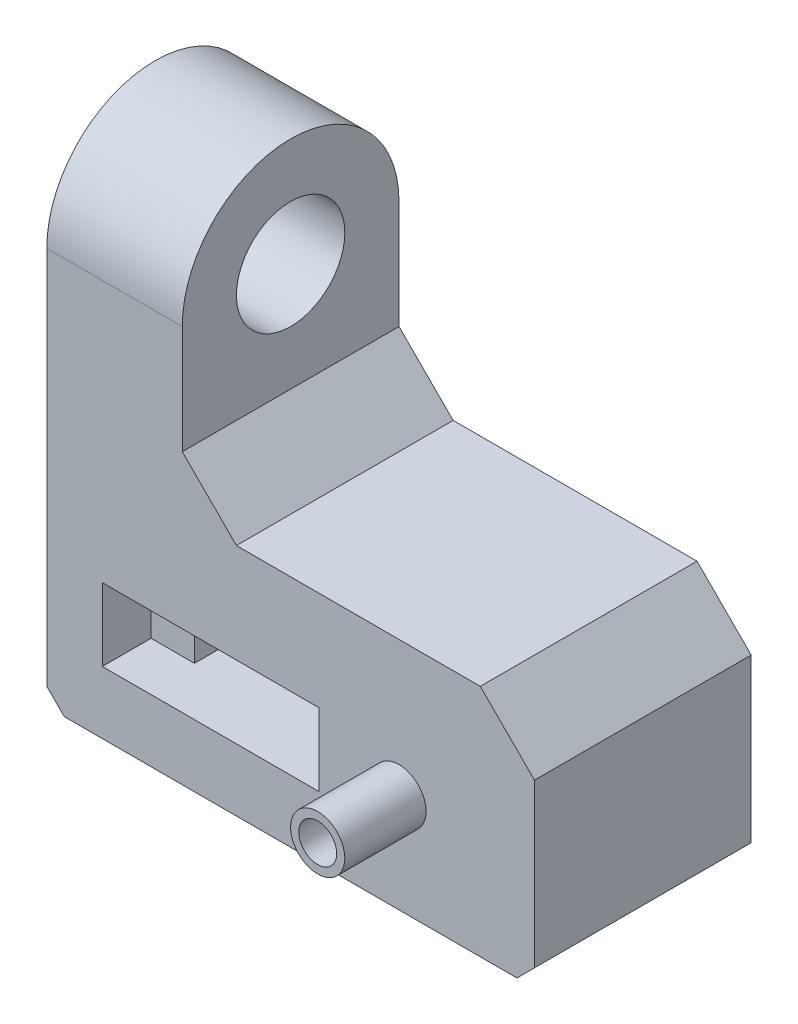
ISO-10303-21;
HEADER;
FILE_DESCRIPTION(('STEP AP214'),'2;1');
FILE_NAME('part.step','',(''),(''),'','','');
FILE_SCHEMA(('AUTOMOTIVE_DESIGN { 1 0 10303 214 1 1 1 1 }'));
ENDSEC;
DATA;
#1=APPLICATION_CONTEXT('core data for automotive mechanical design processes');
#2=APPLICATION_PROTOCOL_DEFINITION('international standard','automotive_design',2000,#1);
#3=PRODUCT_CONTEXT('',#1,'mechanical');
#4=PRODUCT('Part','Part','',(#3));
#5=PRODUCT_RELATED_PRODUCT_CATEGORY('part','',(#4));
#6=PRODUCT_DEFINITION_FORMATION('','',#4);
#7=PRODUCT_DEFINITION_CONTEXT('part definition',#1,'design');
#8=PRODUCT_DEFINITION('design','',#6,#7);
#9=PRODUCT_DEFINITION_SHAPE('','',#8);
#10=(LENGTH_UNIT() NAMED_UNIT(*) SI_UNIT(.MILLI.,.METRE.));
#11=(NAMED_UNIT(*) PLANE_ANGLE_UNIT() SI_UNIT($,.RADIAN.));
#12=(NAMED_UNIT(*) SI_UNIT($,.STERADIAN.) SOLID_ANGLE_UNIT());
#13=UNCERTAINTY_MEASURE_WITH_UNIT(LENGTH_MEASURE(1.E-05),#10,'distance_accuracy_value','');
#14=(GEOMETRIC_REPRESENTATION_CONTEXT(3) GLOBAL_UNCERTAINTY_ASSIGNED_CONTEXT((#13)) GLOBAL_UNIT_ASSIGNED_CONTEXT((#10,
#11,#12)) REPRESENTATION_CONTEXT('',''));
#15=CARTESIAN_POINT('',(0.,0.,0.));
#16=DIRECTION('',(0.,0.,1.));
#17=DIRECTION('',(1.,0.,0.));
#18=AXIS2_PLACEMENT_3D('',#15,#16,#17);
#19=CARTESIAN_POINT('',(-46.25,25.,-3.11126983722082));
#20=DIRECTION('',(0.,0.,1.));
#21=DIRECTION('',(1.,0.,0.));
#22=AXIS2_PLACEMENT_3D('',#19,#20,#21);
#23=CYLINDRICAL_SURFACE('',#22,1.1);
#24=CARTESIAN_POINT('',(-46.25,25.,31.));
#25=DIRECTION('',(0.,0.,1.));
#26=DIRECTION('',(1.,0.,0.));
#27=AXIS2_PLACEMENT_3D('',#24,#25,#26);
#28=CIRCLE('',#27,1.1);
#29=CARTESIAN_POINT('',(-45.15,25.,31.));
#30=VERTEX_POINT('',#29);
#31=EDGE_CURVE('E456',#30,#30,#28,.T.);
#32=ORIENTED_EDGE('',*,*,#31,.T.);
#33=EDGE_LOOP('',(#32));
#34=FACE_BOUND('',#33,.T.);
#35=CARTESIAN_POINT('',(-46.25,25.,7.18643250277138));
#36=DIRECTION('',(0.,0.,-1.));
#37=DIRECTION('',(-1.,0.,0.));
#38=AXIS2_PLACEMENT_3D('',#35,#36,#37);
#39=CIRCLE('',#38,1.1);
#40=CARTESIAN_POINT('',(-47.35,25.,7.18643250277138));
#41=VERTEX_POINT('',#40);
#42=EDGE_CURVE('E12',#41,#41,#39,.F.);
#43=ORIENTED_EDGE('',*,*,#42,.F.);
#44=EDGE_LOOP('',(#43));
#45=FACE_BOUND('',#44,.T.);
#46=ADVANCED_FACE('F73',(#34,#45),#23,.F.);
#47=CARTESIAN_POINT('',(-79.75,31.7,31.));
#48=DIRECTION('',(0.,1.,0.));
#49=DIRECTION('',(0.,0.,1.));
#50=AXIS2_PLACEMENT_3D('',#47,#48,#49);
#51=PLANE('',#50);
#52=DIRECTION('',(0.,0.,1.));
#53=VECTOR('',#52,1.);
#54=CARTESIAN_POINT('',(-71.75,31.7,-27.4874516825405));
#55=LINE('',#54,#53);
#56=CARTESIAN_POINT('',(-71.75,31.7,22.1864325027714));
#57=VERTEX_POINT('',#56);
#58=CARTESIAN_POINT('',(-71.75,31.7,31.));
#59=VERTEX_POINT('',#58);
#60=EDGE_CURVE('E433',#57,#59,#55,.T.);
#61=ORIENTED_EDGE('',*,*,#60,.F.);
#62=DIRECTION('',(1.,0.,0.));
#63=VECTOR('',#62,1.);
#64=CARTESIAN_POINT('',(-79.75,31.7,22.1864325027714));
#65=LINE('',#64,#63);
#66=CARTESIAN_POINT('',(-47.75,31.7,22.1864325027714));
#67=VERTEX_POINT('',#66);
#68=EDGE_CURVE('E494',#57,#67,#65,.T.);
#69=ORIENTED_EDGE('',*,*,#68,.T.);
#70=DIRECTION('',(0.,0.,1.));
#71=VECTOR('',#70,1.);
#72=CARTESIAN_POINT('',(-47.75,31.7,-27.4874516825405));
#73=LINE('',#72,#71);
#74=CARTESIAN_POINT('',(-47.75,31.7,31.));
#75=VERTEX_POINT('',#74);
#76=EDGE_CURVE('E428',#67,#75,#73,.T.);
#77=ORIENTED_EDGE('',*,*,#76,.T.);
#78=DIRECTION('',(-1.,0.,0.));
#79=VECTOR('',#78,1.);
#80=CARTESIAN_POINT('',(-79.75,31.7,31.));
#81=LINE('',#80,#79);
#82=CARTESIAN_POINT('',(-39.75,31.7,31.));
#83=VERTEX_POINT('',#82);
#84=EDGE_CURVE('E374',#83,#75,#81,.T.);
#85=ORIENTED_EDGE('',*,*,#84,.F.);
#86=DIRECTION('',(0.,0.,1.));
#87=VECTOR('',#86,1.);
#88=CARTESIAN_POINT('',(-39.75,31.7,31.));
#89=LINE('',#88,#87);
#90=CARTESIAN_POINT('',(-39.75,31.7,40.));
#91=VERTEX_POINT('',#90);
#92=EDGE_CURVE('E377',#83,#91,#89,.T.);
#93=ORIENTED_EDGE('',*,*,#92,.T.);
#94=DIRECTION('',(-1.,0.,0.));
#95=VECTOR('',#94,1.);
#96=CARTESIAN_POINT('',(-79.75,31.7,40.));
#97=LINE('',#96,#95);
#98=CARTESIAN_POINT('',(-79.75,31.7,40.));
#99=VERTEX_POINT('',#98);
#100=EDGE_CURVE('E382',#91,#99,#97,.T.);
#101=ORIENTED_EDGE('',*,*,#100,.T.);
#102=DIRECTION('',(0.,0.,1.));
#103=VECTOR('',#102,1.);
#104=CARTESIAN_POINT('',(-79.75,31.7,31.));
#105=LINE('',#104,#103);
#106=CARTESIAN_POINT('',(-79.75,31.7,31.));
#107=VERTEX_POINT('',#106);
#108=EDGE_CURVE('E357',#107,#99,#105,.T.);
#109=ORIENTED_EDGE('',*,*,#108,.F.);
#110=EDGE_CURVE('E402',#59,#107,#81,.T.);
#111=ORIENTED_EDGE('',*,*,#110,.F.);
#112=EDGE_LOOP('',(#61,#69,#77,#85,#93,#101,#109,#111));
#113=FACE_BOUND('',#112,.T.);
#114=ADVANCED_FACE('F608',(#113),#51,.F.);
#115=CARTESIAN_POINT('',(-79.75,18.3,31.));
#116=DIRECTION('',(0.,-1.,0.));
#117=DIRECTION('',(1.,0.,0.));
#118=AXIS2_PLACEMENT_3D('',#115,#116,#117);
#119=PLANE('',#118);
#120=DIRECTION('',(0.,0.,1.));
#121=VECTOR('',#120,1.);
#122=CARTESIAN_POINT('',(-47.75,18.3,-27.4874516825405));
#123=LINE('',#122,#121);
#124=CARTESIAN_POINT('',(-47.75,18.3,22.1864325027714));
#125=VERTEX_POINT('',#124);
#126=CARTESIAN_POINT('',(-47.75,18.3,31.));
#127=VERTEX_POINT('',#126);
#128=EDGE_CURVE('E422',#125,#127,#123,.T.);
#129=ORIENTED_EDGE('',*,*,#128,.F.);
#130=DIRECTION('',(-1.,0.,0.));
#131=VECTOR('',#130,1.);
#132=CARTESIAN_POINT('',(-79.75,18.3,22.1864325027714));
#133=LINE('',#132,#131);
#134=CARTESIAN_POINT('',(-71.75,18.3,22.1864325027714));
#135=VERTEX_POINT('',#134);
#136=EDGE_CURVE('E498',#125,#135,#133,.T.);
#137=ORIENTED_EDGE('',*,*,#136,.T.);
#138=DIRECTION('',(0.,0.,1.));
#139=VECTOR('',#138,1.);
#140=CARTESIAN_POINT('',(-71.75,18.3,-27.4874516825405));
#141=LINE('',#140,#139);
#142=CARTESIAN_POINT('',(-71.75,18.3,31.));
#143=VERTEX_POINT('',#142);
#144=EDGE_CURVE('E423',#135,#143,#141,.T.);
#145=ORIENTED_EDGE('',*,*,#144,.T.);
#146=DIRECTION('',(1.,0.,0.));
#147=VECTOR('',#146,1.);
#148=CARTESIAN_POINT('',(-79.75,18.3,31.));
#149=LINE('',#148,#147);
#150=CARTESIAN_POINT('',(-79.75,18.3,31.));
#151=VERTEX_POINT('',#150);
#152=EDGE_CURVE('E407',#151,#143,#149,.T.);
#153=ORIENTED_EDGE('',*,*,#152,.F.);
#154=DIRECTION('',(0.,0.,1.));
#155=VECTOR('',#154,1.);
#156=CARTESIAN_POINT('',(-79.75,18.3,31.));
#157=LINE('',#156,#155);
#158=CARTESIAN_POINT('',(-79.75,18.3,40.));
#159=VERTEX_POINT('',#158);
#160=EDGE_CURVE('E369',#151,#159,#157,.T.);
#161=ORIENTED_EDGE('',*,*,#160,.T.);
#162=DIRECTION('',(1.,0.,0.));
#163=VECTOR('',#162,1.);
#164=CARTESIAN_POINT('',(-79.75,18.3,40.));
#165=LINE('',#164,#163);
#166=CARTESIAN_POINT('',(-39.75,18.3,40.));
#167=VERTEX_POINT('',#166);
#168=EDGE_CURVE('E391',#159,#167,#165,.T.);
#169=ORIENTED_EDGE('',*,*,#168,.T.);
#170=DIRECTION('',(0.,0.,1.));
#171=VECTOR('',#170,1.);
#172=CARTESIAN_POINT('',(-39.75,18.3,31.));
#173=LINE('',#172,#171);
#174=CARTESIAN_POINT('',(-39.75,18.3,31.));
#175=VERTEX_POINT('',#174);
#176=EDGE_CURVE('E373',#175,#167,#173,.T.);
#177=ORIENTED_EDGE('',*,*,#176,.F.);
#178=EDGE_CURVE('E411',#127,#175,#149,.T.);
#179=ORIENTED_EDGE('',*,*,#178,.F.);
#180=EDGE_LOOP('',(#129,#137,#145,#153,#161,#169,#177,#179));
#181=FACE_BOUND('',#180,.T.);
#182=ADVANCED_FACE('F615',(#181),#119,.F.);
#183=CARTESIAN_POINT('',(-71.75,18.3,-27.4874516825405));
#184=DIRECTION('',(-1.,0.,0.));
#185=DIRECTION('',(0.,0.,1.));
#186=AXIS2_PLACEMENT_3D('',#183,#184,#185);
#187=PLANE('',#186);
#188=ORIENTED_EDGE('',*,*,#144,.F.);
#189=DIRECTION('',(0.,1.,0.));
#190=VECTOR('',#189,1.);
#191=CARTESIAN_POINT('',(-71.75,18.3,22.1864325027714));
#192=LINE('',#191,#190);
#193=EDGE_CURVE('E304',#135,#57,#192,.T.);
#194=ORIENTED_EDGE('',*,*,#193,.T.);
#195=ORIENTED_EDGE('',*,*,#60,.T.);
#196=DIRECTION('',(0.,-1.,0.));
#197=VECTOR('',#196,1.);
#198=CARTESIAN_POINT('',(-71.75,18.3,31.));
#199=LINE('',#198,#197);
#200=EDGE_CURVE('E443',#59,#143,#199,.T.);
#201=ORIENTED_EDGE('',*,*,#200,.T.);
#202=EDGE_LOOP('',(#188,#194,#195,#201));
#203=FACE_BOUND('',#202,.T.);
#204=ADVANCED_FACE('F634',(#203),#187,.F.);
#205=CARTESIAN_POINT('',(-73.25,25.,-3.11126983722082));
#206=DIRECTION('',(0.,0.,1.));
#207=DIRECTION('',(1.,0.,0.));
#208=AXIS2_PLACEMENT_3D('',#205,#206,#207);
#209=CYLINDRICAL_SURFACE('',#208,1.10000000000001);
#210=CARTESIAN_POINT('',(-73.25,25.,22.1864325027714));
#211=DIRECTION('',(0.,0.,1.));
#212=DIRECTION('',(1.,0.,0.));
#213=AXIS2_PLACEMENT_3D('',#210,#211,#212);
#214=CIRCLE('',#213,1.10000000000001);
#215=CARTESIAN_POINT('',(-72.15,25.,22.1864325027714));
#216=VERTEX_POINT('',#215);
#217=EDGE_CURVE('E301',#216,#216,#214,.F.);
#218=ORIENTED_EDGE('',*,*,#217,.T.);
#219=EDGE_LOOP('',(#218));
#220=FACE_BOUND('',#219,.T.);
#221=CARTESIAN_POINT('',(-73.25,25.,31.));
#222=DIRECTION('',(0.,0.,1.));
#223=DIRECTION('',(1.,0.,0.));
#224=AXIS2_PLACEMENT_3D('',#221,#222,#223);
#225=CIRCLE('',#224,1.10000000000001);
#226=CARTESIAN_POINT('',(-72.15,25.,31.));
#227=VERTEX_POINT('',#226);
#228=EDGE_CURVE('E447',#227,#227,#225,.T.);
#229=ORIENTED_EDGE('',*,*,#228,.T.);
#230=EDGE_LOOP('',(#229));
#231=FACE_BOUND('',#230,.T.);
#232=ADVANCED_FACE('F622',(#220,#231),#209,.F.);
#233=CARTESIAN_POINT('',(-90.,50.,40.));
#234=DIRECTION('',(1.,0.,0.));
#235=DIRECTION('',(0.,0.,-1.));
#236=AXIS2_PLACEMENT_3D('',#233,#234,#235);
#237=PLANE('',#236);
#238=DIRECTION('',(0.,1.,0.));
#239=VECTOR('',#238,1.);
#240=CARTESIAN_POINT('',(-90.,35.,22.1864325027714));
#241=LINE('',#240,#239);
#242=CARTESIAN_POINT('',(-90.,15.,22.1864325027714));
#243=VERTEX_POINT('',#242);
#244=CARTESIAN_POINT('',(-90.,35.,22.1864325027714));
#245=VERTEX_POINT('',#244);
#246=EDGE_CURVE('E553',#243,#245,#241,.T.);
#247=ORIENTED_EDGE('',*,*,#246,.F.);
#248=DIRECTION('',(0.,0.,1.));
#249=VECTOR('',#248,1.);
#250=CARTESIAN_POINT('',(-90.,15.,7.18643250277138));
#251=LINE('',#250,#249);
#252=CARTESIAN_POINT('',(-90.,15.,7.18643250277138));
#253=VERTEX_POINT('',#252);
#254=EDGE_CURVE('E549',#253,#243,#251,.T.);
#255=ORIENTED_EDGE('',*,*,#254,.F.);
#256=DIRECTION('',(0.,-1.,0.));
#257=VECTOR('',#256,1.);
#258=CARTESIAN_POINT('',(-90.,35.,7.18643250277138));
#259=LINE('',#258,#257);
#260=CARTESIAN_POINT('',(-90.,35.,7.18643250277138));
#261=VERTEX_POINT('',#260);
#262=EDGE_CURVE('E255',#261,#253,#259,.T.);
#263=ORIENTED_EDGE('',*,*,#262,.F.);
#264=DIRECTION('',(0.,0.,-1.));
#265=VECTOR('',#264,1.);
#266=CARTESIAN_POINT('',(-90.,35.,7.18643250277138));
#267=LINE('',#266,#265);
#268=EDGE_CURVE('E98',#245,#261,#267,.T.);
#269=ORIENTED_EDGE('',*,*,#268,.F.);
#270=EDGE_LOOP('',(#247,#255,#263,#269));
#271=FACE_BOUND('',#270,.T.);
#272=CARTESIAN_POINT('',(-90.,80.,20.));
#273=DIRECTION('',(1.,0.,0.));
#274=DIRECTION('',(0.,0.,-1.));
#275=AXIS2_PLACEMENT_3D('',#272,#273,#274);
#276=CIRCLE('',#275,10.);
#277=CARTESIAN_POINT('',(-90.,80.,10.));
#278=VERTEX_POINT('',#277);
#279=EDGE_CURVE('E490',#278,#278,#276,.F.);
#280=ORIENTED_EDGE('',*,*,#279,.F.);
#281=EDGE_LOOP('',(#280));
#282=FACE_BOUND('',#281,.T.);
#283=DIRECTION('',(0.,-1.,0.));
#284=VECTOR('',#283,1.);
#285=CARTESIAN_POINT('',(-90.,50.,0.));
#286=LINE('',#285,#284);
#287=CARTESIAN_POINT('',(-90.,80.,0.));
#288=VERTEX_POINT('',#287);
#289=CARTESIAN_POINT('',(-90.,10.,0.));
#290=VERTEX_POINT('',#289);
#291=EDGE_CURVE('E351',#288,#290,#286,.T.);
#292=ORIENTED_EDGE('',*,*,#291,.T.);
#293=DIRECTION('',(0.,0.,1.));
#294=VECTOR('',#293,1.);
#295=CARTESIAN_POINT('',(-90.,10.,40.));
#296=LINE('',#295,#294);
#297=CARTESIAN_POINT('',(-90.,10.,40.));
#298=VERTEX_POINT('',#297);
#299=EDGE_CURVE('E275',#290,#298,#296,.T.);
#300=ORIENTED_EDGE('',*,*,#299,.T.);
#301=DIRECTION('',(0.,-1.,0.));
#302=VECTOR('',#301,1.);
#303=CARTESIAN_POINT('',(-90.,50.,40.));
#304=LINE('',#303,#302);
#305=CARTESIAN_POINT('',(-90.,80.,40.));
#306=VERTEX_POINT('',#305);
#307=EDGE_CURVE('E355',#306,#298,#304,.T.);
#308=ORIENTED_EDGE('',*,*,#307,.F.);
#309=CARTESIAN_POINT('',(-90.,80.,20.));
#310=DIRECTION('',(1.,0.,0.));
#311=DIRECTION('',(0.,0.,-1.));
#312=AXIS2_PLACEMENT_3D('',#309,#310,#311);
#313=CIRCLE('',#312,20.);
#314=EDGE_CURVE('E471',#306,#288,#313,.F.);
#315=ORIENTED_EDGE('',*,*,#314,.T.);
#316=EDGE_LOOP('',(#292,#300,#308,#315));
#317=FACE_BOUND('',#316,.T.);
#318=ADVANCED_FACE('F685',(#271,#282,#317),#237,.F.);
#319=CARTESIAN_POINT('',(-65.,100.,0.));
#320=DIRECTION('',(1.,0.,0.));
#321=DIRECTION('',(0.,0.,-1.));
#322=AXIS2_PLACEMENT_3D('',#319,#320,#321);
#323=PLANE('',#322);
#324=CARTESIAN_POINT('',(-65.,80.,20.));
#325=DIRECTION('',(1.,0.,0.));
#326=DIRECTION('',(0.,0.,-1.));
#327=AXIS2_PLACEMENT_3D('',#324,#325,#326);
#328=CIRCLE('',#327,10.);
#329=CARTESIAN_POINT('',(-65.,80.,10.));
#330=VERTEX_POINT('',#329);
#331=EDGE_CURVE('E486',#330,#330,#328,.T.);
#332=ORIENTED_EDGE('',*,*,#331,.F.);
#333=EDGE_LOOP('',(#332));
#334=FACE_BOUND('',#333,.T.);
#335=DIRECTION('',(0.,-1.,0.));
#336=VECTOR('',#335,1.);
#337=CARTESIAN_POINT('',(-65.,100.,40.));
#338=LINE('',#337,#336);
#339=CARTESIAN_POINT('',(-65.,80.,40.));
#340=VERTEX_POINT('',#339);
#341=CARTESIAN_POINT('',(-65.,60.,40.));
#342=VERTEX_POINT('',#341);
#343=EDGE_CURVE('E467',#340,#342,#338,.T.);
#344=ORIENTED_EDGE('',*,*,#343,.T.);
#345=DIRECTION('',(0.,0.,-1.));
#346=VECTOR('',#345,1.);
#347=CARTESIAN_POINT('',(-65.,60.,0.));
#348=LINE('',#347,#346);
#349=CARTESIAN_POINT('',(-65.,60.,0.));
#350=VERTEX_POINT('',#349);
#351=EDGE_CURVE('E292',#342,#350,#348,.T.);
#352=ORIENTED_EDGE('',*,*,#351,.T.);
#353=DIRECTION('',(0.,-1.,0.));
#354=VECTOR('',#353,1.);
#355=CARTESIAN_POINT('',(-65.,100.,0.));
#356=LINE('',#355,#354);
#357=CARTESIAN_POINT('',(-65.,80.,0.));
#358=VERTEX_POINT('',#357);
#359=EDGE_CURVE('E460',#358,#350,#356,.T.);
#360=ORIENTED_EDGE('',*,*,#359,.F.);
#361=CARTESIAN_POINT('',(-65.,80.,20.));
#362=DIRECTION('',(1.,0.,0.));
#363=DIRECTION('',(0.,0.,-1.));
#364=AXIS2_PLACEMENT_3D('',#361,#362,#363);
#365=CIRCLE('',#364,20.);
#366=EDGE_CURVE('E476',#358,#340,#365,.T.);
#367=ORIENTED_EDGE('',*,*,#366,.T.);
#368=EDGE_LOOP('',(#344,#352,#360,#367));
#369=FACE_BOUND('',#368,.T.);
#370=ADVANCED_FACE('F638',(#334,#369),#323,.T.);
#371=CARTESIAN_POINT('',(0.,0.,31.));
#372=DIRECTION('',(0.,0.,-1.));
#373=DIRECTION('',(-1.,0.,0.));
#374=AXIS2_PLACEMENT_3D('',#371,#372,#373);
#375=PLANE('',#374);
#376=ORIENTED_EDGE('',*,*,#228,.F.);
#377=EDGE_LOOP('',(#376));
#378=FACE_BOUND('',#377,.T.);
#379=ORIENTED_EDGE('',*,*,#200,.F.);
#380=ORIENTED_EDGE('',*,*,#110,.T.);
#381=DIRECTION('',(0.,-1.,0.));
#382=VECTOR('',#381,1.);
#383=CARTESIAN_POINT('',(-79.75,18.3,31.));
#384=LINE('',#383,#382);
#385=EDGE_CURVE('E386',#107,#151,#384,.T.);
#386=ORIENTED_EDGE('',*,*,#385,.T.);
#387=ORIENTED_EDGE('',*,*,#152,.T.);
#388=EDGE_LOOP('',(#379,#380,#386,#387));
#389=FACE_BOUND('',#388,.T.);
#390=ADVANCED_FACE('F635',(#378,#389),#375,.F.);
#391=ORIENTED_EDGE('',*,*,#31,.F.);
#392=EDGE_LOOP('',(#391));
#393=FACE_BOUND('',#392,.T.);
#394=DIRECTION('',(0.,1.,0.));
#395=VECTOR('',#394,1.);
#396=CARTESIAN_POINT('',(-47.75,18.3,31.));
#397=LINE('',#396,#395);
#398=EDGE_CURVE('E439',#127,#75,#397,.T.);
#399=ORIENTED_EDGE('',*,*,#398,.F.);
#400=ORIENTED_EDGE('',*,*,#178,.T.);
#401=DIRECTION('',(0.,1.,0.));
#402=VECTOR('',#401,1.);
#403=CARTESIAN_POINT('',(-39.75,18.3,31.));
#404=LINE('',#403,#402);
#405=EDGE_CURVE('E403',#175,#83,#404,.T.);
#406=ORIENTED_EDGE('',*,*,#405,.T.);
#407=ORIENTED_EDGE('',*,*,#84,.T.);
#408=EDGE_LOOP('',(#399,#400,#406,#407));
#409=FACE_BOUND('',#408,.T.);
#410=ADVANCED_FACE('F637',(#393,#409),#375,.F.);
#411=CARTESIAN_POINT('',(0.,50.,40.));
#412=DIRECTION('',(-1.,0.,0.));
#413=DIRECTION('',(0.,-1.,0.));
#414=AXIS2_PLACEMENT_3D('',#411,#412,#413);
#415=PLANE('',#414);
#416=DIRECTION('',(0.,1.,0.));
#417=VECTOR('',#416,1.);
#418=CARTESIAN_POINT('',(0.,50.,40.));
#419=LINE('',#418,#417);
#420=CARTESIAN_POINT('',(0.,9.99999999999999,40.));
#421=VERTEX_POINT('',#420);
#422=CARTESIAN_POINT('',(0.,40.,40.));
#423=VERTEX_POINT('',#422);
#424=EDGE_CURVE('E333',#421,#423,#419,.T.);
#425=ORIENTED_EDGE('',*,*,#424,.F.);
#426=DIRECTION('',(0.,0.,-1.));
#427=VECTOR('',#426,1.);
#428=CARTESIAN_POINT('',(0.,9.99999999999999,40.));
#429=LINE('',#428,#427);
#430=CARTESIAN_POINT('',(0.,9.99999999999999,0.));
#431=VERTEX_POINT('',#430);
#432=EDGE_CURVE('E273',#421,#431,#429,.T.);
#433=ORIENTED_EDGE('',*,*,#432,.T.);
#434=DIRECTION('',(0.,1.,0.));
#435=VECTOR('',#434,1.);
#436=CARTESIAN_POINT('',(0.,50.,0.));
#437=LINE('',#436,#435);
#438=CARTESIAN_POINT('',(0.,40.,0.));
#439=VERTEX_POINT('',#438);
#440=EDGE_CURVE('E346',#431,#439,#437,.T.);
#441=ORIENTED_EDGE('',*,*,#440,.T.);
#442=DIRECTION('',(0.,0.,1.));
#443=VECTOR('',#442,1.);
#444=CARTESIAN_POINT('',(0.,40.,40.));
#445=LINE('',#444,#443);
#446=EDGE_CURVE('E343',#439,#423,#445,.T.);
#447=ORIENTED_EDGE('',*,*,#446,.T.);
#448=EDGE_LOOP('',(#425,#433,#441,#447));
#449=FACE_BOUND('',#448,.T.);
#450=ADVANCED_FACE('F349',(#449),#415,.F.);
#451=CARTESIAN_POINT('',(-90.,50.,40.));
#452=DIRECTION('',(0.,-1.,0.));
#453=DIRECTION('',(0.,0.,-1.));
#454=AXIS2_PLACEMENT_3D('',#451,#452,#453);
#455=PLANE('',#454);
#456=DIRECTION('',(-1.,0.,0.));
#457=VECTOR('',#456,1.);
#458=CARTESIAN_POINT('',(-90.,50.,0.));
#459=LINE('',#458,#457);
#460=CARTESIAN_POINT('',(-10.,50.,0.));
#461=VERTEX_POINT('',#460);
#462=CARTESIAN_POINT('',(-54.9999999999999,50.,0.));
#463=VERTEX_POINT('',#462);
#464=EDGE_CURVE('E347',#461,#463,#459,.T.);
#465=ORIENTED_EDGE('',*,*,#464,.T.);
#466=DIRECTION('',(0.,0.,1.));
#467=VECTOR('',#466,1.);
#468=CARTESIAN_POINT('',(-54.9999999999999,50.,40.));
#469=LINE('',#468,#467);
#470=CARTESIAN_POINT('',(-54.9999999999999,50.,40.));
#471=VERTEX_POINT('',#470);
#472=EDGE_CURVE('E288',#463,#471,#469,.T.);
#473=ORIENTED_EDGE('',*,*,#472,.T.);
#474=DIRECTION('',(-1.,0.,0.));
#475=VECTOR('',#474,1.);
#476=CARTESIAN_POINT('',(-90.,50.,40.));
#477=LINE('',#476,#475);
#478=CARTESIAN_POINT('',(-10.,50.,40.));
#479=VERTEX_POINT('',#478);
#480=EDGE_CURVE('E332',#479,#471,#477,.T.);
#481=ORIENTED_EDGE('',*,*,#480,.F.);
#482=DIRECTION('',(0.,0.,-1.));
#483=VECTOR('',#482,1.);
#484=CARTESIAN_POINT('',(-9.99999999999999,50.,40.));
#485=LINE('',#484,#483);
#486=EDGE_CURVE('E279',#479,#461,#485,.T.);
#487=ORIENTED_EDGE('',*,*,#486,.T.);
#488=EDGE_LOOP('',(#465,#473,#481,#487));
#489=FACE_BOUND('',#488,.T.);
#490=ADVANCED_FACE('F339',(#489),#455,.F.);
#491=CARTESIAN_POINT('',(0.,0.,40.));
#492=DIRECTION('',(0.,0.,1.));
#493=DIRECTION('',(1.,0.,0.));
#494=AXIS2_PLACEMENT_3D('',#491,#492,#493);
#495=PLANE('',#494);
#496=CARTESIAN_POINT('',(-25.,25.,40.));
#497=DIRECTION('',(0.,0.,1.));
#498=DIRECTION('',(1.,0.,0.));
#499=AXIS2_PLACEMENT_3D('',#496,#497,#498);
#500=CIRCLE('',#499,5.);
#501=CARTESIAN_POINT('',(-20.,25.,40.));
#502=VERTEX_POINT('',#501);
#503=EDGE_CURVE('E559',#502,#502,#500,.T.);
#504=ORIENTED_EDGE('',*,*,#503,.F.);
#505=EDGE_LOOP('',(#504));
#506=FACE_BOUND('',#505,.T.);
#507=DIRECTION('',(-1.,0.,0.));
#508=VECTOR('',#507,1.);
#509=CARTESIAN_POINT('',(-93.7864235732791,6.77047108286588,40.));
#510=LINE('',#509,#508);
#511=CARTESIAN_POINT('',(-3.22952891713418,6.77047108286586,40.));
#512=VERTEX_POINT('',#511);
#513=CARTESIAN_POINT('',(-86.7704710828659,6.77047108286589,40.));
#514=VERTEX_POINT('',#513);
#515=EDGE_CURVE('E90',#512,#514,#510,.T.);
#516=ORIENTED_EDGE('',*,*,#515,.F.);
#517=DIRECTION('',(-0.70710678118655,-0.707106781186546,0.));
#518=VECTOR('',#517,1.);
#519=CARTESIAN_POINT('',(-5.,5.00000000000002,40.));
#520=LINE('',#519,#518);
#521=EDGE_CURVE('E262',#512,#421,#520,.F.);
#522=ORIENTED_EDGE('',*,*,#521,.T.);
#523=ORIENTED_EDGE('',*,*,#424,.T.);
#524=DIRECTION('',(0.707106781186545,-0.70710678118655,0.));
#525=VECTOR('',#524,1.);
#526=CARTESIAN_POINT('',(20.,19.9999999999999,40.));
#527=LINE('',#526,#525);
#528=EDGE_CURVE('E281',#423,#479,#527,.F.);
#529=ORIENTED_EDGE('',*,*,#528,.T.);
#530=ORIENTED_EDGE('',*,*,#480,.T.);
#531=DIRECTION('',(-0.707106781186551,0.707106781186544,0.));
#532=VECTOR('',#531,1.);
#533=CARTESIAN_POINT('',(-54.9999999999999,50.,40.));
#534=LINE('',#533,#532);
#535=EDGE_CURVE('E295',#471,#342,#534,.T.);
#536=ORIENTED_EDGE('',*,*,#535,.T.);
#537=ORIENTED_EDGE('',*,*,#343,.F.);
#538=DIRECTION('',(1.,0.,0.));
#539=VECTOR('',#538,1.);
#540=CARTESIAN_POINT('',(-118.284271247462,80.,40.));
#541=LINE('',#540,#539);
#542=EDGE_CURVE('E479',#306,#340,#541,.T.);
#543=ORIENTED_EDGE('',*,*,#542,.F.);
#544=ORIENTED_EDGE('',*,*,#307,.T.);
#545=DIRECTION('',(-0.707106781186546,0.70710678118655,0.));
#546=VECTOR('',#545,1.);
#547=CARTESIAN_POINT('',(-40.0000000000002,-40.,40.));
#548=LINE('',#547,#546);
#549=EDGE_CURVE('E266',#298,#514,#548,.F.);
#550=ORIENTED_EDGE('',*,*,#549,.T.);
#551=EDGE_LOOP('',(#516,#522,#523,#529,#530,#536,#537,#543,#544,#550));
#552=FACE_BOUND('',#551,.T.);
#553=DIRECTION('',(0.,-1.,0.));
#554=VECTOR('',#553,1.);
#555=CARTESIAN_POINT('',(-79.75,18.3,40.));
#556=LINE('',#555,#554);
#557=EDGE_CURVE('E395',#99,#159,#556,.T.);
#558=ORIENTED_EDGE('',*,*,#557,.F.);
#559=ORIENTED_EDGE('',*,*,#100,.F.);
#560=DIRECTION('',(0.,1.,0.));
#561=VECTOR('',#560,1.);
#562=CARTESIAN_POINT('',(-39.75,18.3,40.));
#563=LINE('',#562,#561);
#564=EDGE_CURVE('E387',#167,#91,#563,.T.);
#565=ORIENTED_EDGE('',*,*,#564,.F.);
#566=ORIENTED_EDGE('',*,*,#168,.F.);
#567=EDGE_LOOP('',(#558,#559,#565,#566));
#568=FACE_BOUND('',#567,.T.);
#569=ADVANCED_FACE('F259',(#506,#552,#568),#495,.T.);
#570=CARTESIAN_POINT('',(0.,0.,0.));
#571=DIRECTION('',(0.,0.,1.));
#572=DIRECTION('',(1.,0.,0.));
#573=AXIS2_PLACEMENT_3D('',#570,#571,#572);
#574=PLANE('',#573);
#575=DIRECTION('',(1.,0.,0.));
#576=VECTOR('',#575,1.);
#577=CARTESIAN_POINT('',(-71.75,31.7,0.));
#578=LINE('',#577,#576);
#579=CARTESIAN_POINT('',(-71.75,31.7,0.));
#580=VERTEX_POINT('',#579);
#581=CARTESIAN_POINT('',(-47.75,31.7,0.));
#582=VERTEX_POINT('',#581);
#583=EDGE_CURVE('E450',#580,#582,#578,.T.);
#584=ORIENTED_EDGE('',*,*,#583,.F.);
#585=DIRECTION('',(0.,1.,0.));
#586=VECTOR('',#585,1.);
#587=CARTESIAN_POINT('',(-71.75,18.3,0.));
#588=LINE('',#587,#586);
#589=CARTESIAN_POINT('',(-71.75,18.3,0.));
#590=VERTEX_POINT('',#589);
#591=EDGE_CURVE('E417',#590,#580,#588,.T.);
#592=ORIENTED_EDGE('',*,*,#591,.F.);
#593=DIRECTION('',(-1.,0.,0.));
#594=VECTOR('',#593,1.);
#595=CARTESIAN_POINT('',(-71.75,18.3,0.));
#596=LINE('',#595,#594);
#597=CARTESIAN_POINT('',(-47.75,18.3,0.));
#598=VERTEX_POINT('',#597);
#599=EDGE_CURVE('E398',#598,#590,#596,.T.);
#600=ORIENTED_EDGE('',*,*,#599,.F.);
#601=DIRECTION('',(0.,-1.,0.));
#602=VECTOR('',#601,1.);
#603=CARTESIAN_POINT('',(-47.75,18.3,0.));
#604=LINE('',#603,#602);
#605=EDGE_CURVE('E438',#582,#598,#604,.T.);
#606=ORIENTED_EDGE('',*,*,#605,.F.);
#607=EDGE_LOOP('',(#584,#592,#600,#606));
#608=FACE_BOUND('',#607,.T.);
#609=DIRECTION('',(0.70710678118655,0.707106781186546,0.));
#610=VECTOR('',#609,1.);
#611=CARTESIAN_POINT('',(0.,9.99999999999999,0.));
#612=LINE('',#611,#610);
#613=CARTESIAN_POINT('',(-3.22952891713413,6.77047108286588,0.));
#614=VERTEX_POINT('',#613);
#615=EDGE_CURVE('E315',#431,#614,#612,.F.);
#616=ORIENTED_EDGE('',*,*,#615,.T.);
#617=DIRECTION('',(-1.,0.,0.));
#618=VECTOR('',#617,1.);
#619=CARTESIAN_POINT('',(0.,6.77047108286588,0.));
#620=LINE('',#619,#618);
#621=CARTESIAN_POINT('',(-86.7704710828658,6.77047108286588,0.));
#622=VERTEX_POINT('',#621);
#623=EDGE_CURVE('E250',#614,#622,#620,.T.);
#624=ORIENTED_EDGE('',*,*,#623,.T.);
#625=DIRECTION('',(0.707106781186546,-0.70710678118655,0.));
#626=VECTOR('',#625,1.);
#627=CARTESIAN_POINT('',(-80.,0.,0.));
#628=LINE('',#627,#626);
#629=EDGE_CURVE('E312',#622,#290,#628,.F.);
#630=ORIENTED_EDGE('',*,*,#629,.T.);
#631=ORIENTED_EDGE('',*,*,#291,.F.);
#632=DIRECTION('',(1.,0.,0.));
#633=VECTOR('',#632,1.);
#634=CARTESIAN_POINT('',(-118.284271247462,80.,0.));
#635=LINE('',#634,#633);
#636=EDGE_CURVE('E472',#288,#358,#635,.T.);
#637=ORIENTED_EDGE('',*,*,#636,.T.);
#638=ORIENTED_EDGE('',*,*,#359,.T.);
#639=DIRECTION('',(0.707106781186551,-0.707106781186544,0.));
#640=VECTOR('',#639,1.);
#641=CARTESIAN_POINT('',(-2.49999999999964,-2.49999999999967,0.));
#642=LINE('',#641,#640);
#643=EDGE_CURVE('E298',#350,#463,#642,.T.);
#644=ORIENTED_EDGE('',*,*,#643,.T.);
#645=ORIENTED_EDGE('',*,*,#464,.F.);
#646=DIRECTION('',(-0.707106781186545,0.70710678118655,0.));
#647=VECTOR('',#646,1.);
#648=CARTESIAN_POINT('',(-9.99999999999999,50.,0.));
#649=LINE('',#648,#647);
#650=EDGE_CURVE('E321',#461,#439,#649,.F.);
#651=ORIENTED_EDGE('',*,*,#650,.T.);
#652=ORIENTED_EDGE('',*,*,#440,.F.);
#653=EDGE_LOOP('',(#616,#624,#630,#631,#637,#638,#644,#645,#651,#652));
#654=FACE_BOUND('',#653,.T.);
#655=ADVANCED_FACE('F310',(#608,#654),#574,.F.);
#656=CARTESIAN_POINT('',(-79.75,18.3,31.));
#657=DIRECTION('',(-1.,0.,0.));
#658=DIRECTION('',(0.,0.,1.));
#659=AXIS2_PLACEMENT_3D('',#656,#657,#658);
#660=PLANE('',#659);
#661=ORIENTED_EDGE('',*,*,#557,.T.);
#662=ORIENTED_EDGE('',*,*,#160,.F.);
#663=ORIENTED_EDGE('',*,*,#385,.F.);
#664=ORIENTED_EDGE('',*,*,#108,.T.);
#665=EDGE_LOOP('',(#661,#662,#663,#664));
#666=FACE_BOUND('',#665,.T.);
#667=ADVANCED_FACE('F601',(#666),#660,.F.);
#668=CARTESIAN_POINT('',(-47.75,31.7,7.18643250277138));
#669=VERTEX_POINT('',#668);
#670=EDGE_CURVE('E429',#582,#669,#73,.T.);
#671=ORIENTED_EDGE('',*,*,#670,.T.);
#672=DIRECTION('',(-1.,0.,0.));
#673=VECTOR('',#672,1.);
#674=CARTESIAN_POINT('',(-79.75,31.7,7.18643250277138));
#675=LINE('',#674,#673);
#676=CARTESIAN_POINT('',(-71.75,31.7,7.18643250277138));
#677=VERTEX_POINT('',#676);
#678=EDGE_CURVE('E305',#669,#677,#675,.T.);
#679=ORIENTED_EDGE('',*,*,#678,.T.);
#680=EDGE_CURVE('E434',#580,#677,#55,.T.);
#681=ORIENTED_EDGE('',*,*,#680,.F.);
#682=ORIENTED_EDGE('',*,*,#583,.T.);
#683=EDGE_LOOP('',(#671,#679,#681,#682));
#684=FACE_BOUND('',#683,.T.);
#685=ADVANCED_FACE('F618',(#684),#51,.F.);
#686=CARTESIAN_POINT('',(-39.75,18.3,31.));
#687=DIRECTION('',(1.,0.,0.));
#688=DIRECTION('',(0.,0.,-1.));
#689=AXIS2_PLACEMENT_3D('',#686,#687,#688);
#690=PLANE('',#689);
#691=ORIENTED_EDGE('',*,*,#564,.T.);
#692=ORIENTED_EDGE('',*,*,#92,.F.);
#693=ORIENTED_EDGE('',*,*,#405,.F.);
#694=ORIENTED_EDGE('',*,*,#176,.T.);
#695=EDGE_LOOP('',(#691,#692,#693,#694));
#696=FACE_BOUND('',#695,.T.);
#697=ADVANCED_FACE('F642',(#696),#690,.F.);
#698=CARTESIAN_POINT('',(-71.75,18.3,7.18643250277138));
#699=VERTEX_POINT('',#698);
#700=EDGE_CURVE('E418',#590,#699,#141,.T.);
#701=ORIENTED_EDGE('',*,*,#700,.T.);
#702=DIRECTION('',(1.,0.,0.));
#703=VECTOR('',#702,1.);
#704=CARTESIAN_POINT('',(-79.75,18.3,7.18643250277138));
#705=LINE('',#704,#703);
#706=CARTESIAN_POINT('',(-47.75,18.3,7.18643250277138));
#707=VERTEX_POINT('',#706);
#708=EDGE_CURVE('E508',#699,#707,#705,.T.);
#709=ORIENTED_EDGE('',*,*,#708,.T.);
#710=EDGE_CURVE('E424',#598,#707,#123,.T.);
#711=ORIENTED_EDGE('',*,*,#710,.F.);
#712=ORIENTED_EDGE('',*,*,#599,.T.);
#713=EDGE_LOOP('',(#701,#709,#711,#712));
#714=FACE_BOUND('',#713,.T.);
#715=ADVANCED_FACE('F632',(#714),#119,.F.);
#716=ORIENTED_EDGE('',*,*,#680,.T.);
#717=DIRECTION('',(0.,-1.,0.));
#718=VECTOR('',#717,1.);
#719=CARTESIAN_POINT('',(-71.75,18.3,7.18643250277138));
#720=LINE('',#719,#718);
#721=EDGE_CURVE('E512',#677,#699,#720,.T.);
#722=ORIENTED_EDGE('',*,*,#721,.T.);
#723=ORIENTED_EDGE('',*,*,#700,.F.);
#724=ORIENTED_EDGE('',*,*,#591,.T.);
#725=EDGE_LOOP('',(#716,#722,#723,#724));
#726=FACE_BOUND('',#725,.T.);
#727=ADVANCED_FACE('F628',(#726),#187,.F.);
#728=CARTESIAN_POINT('',(-47.75,18.3,-27.4874516825405));
#729=DIRECTION('',(1.,0.,0.));
#730=DIRECTION('',(0.,0.,-1.));
#731=AXIS2_PLACEMENT_3D('',#728,#729,#730);
#732=PLANE('',#731);
#733=ORIENTED_EDGE('',*,*,#710,.T.);
#734=DIRECTION('',(0.,-1.,0.));
#735=VECTOR('',#734,1.);
#736=CARTESIAN_POINT('',(-47.75,35.,7.18643250277138));
#737=LINE('',#736,#735);
#738=CARTESIAN_POINT('',(-47.75,15.,7.18643250277138));
#739=VERTEX_POINT('',#738);
#740=EDGE_CURVE('E533',#707,#739,#737,.T.);
#741=ORIENTED_EDGE('',*,*,#740,.T.);
#742=DIRECTION('',(0.,0.,1.));
#743=VECTOR('',#742,1.);
#744=CARTESIAN_POINT('',(-47.75,15.,7.18643250277138));
#745=LINE('',#744,#743);
#746=CARTESIAN_POINT('',(-47.75,15.,22.1864325027714));
#747=VERTEX_POINT('',#746);
#748=EDGE_CURVE('E524',#739,#747,#745,.T.);
#749=ORIENTED_EDGE('',*,*,#748,.T.);
#750=DIRECTION('',(0.,1.,0.));
#751=VECTOR('',#750,1.);
#752=CARTESIAN_POINT('',(-47.75,35.,22.1864325027714));
#753=LINE('',#752,#751);
#754=EDGE_CURVE('E529',#747,#125,#753,.T.);
#755=ORIENTED_EDGE('',*,*,#754,.T.);
#756=ORIENTED_EDGE('',*,*,#128,.T.);
#757=ORIENTED_EDGE('',*,*,#398,.T.);
#758=ORIENTED_EDGE('',*,*,#76,.F.);
#759=CARTESIAN_POINT('',(-47.75,35.,22.1864325027714));
#760=VERTEX_POINT('',#759);
#761=EDGE_CURVE('E523',#67,#760,#753,.T.);
#762=ORIENTED_EDGE('',*,*,#761,.T.);
#763=DIRECTION('',(0.,0.,-1.));
#764=VECTOR('',#763,1.);
#765=CARTESIAN_POINT('',(-47.75,35.,7.18643250277138));
#766=LINE('',#765,#764);
#767=CARTESIAN_POINT('',(-47.75,35.,7.18643250277138));
#768=VERTEX_POINT('',#767);
#769=EDGE_CURVE('E528',#760,#768,#766,.T.);
#770=ORIENTED_EDGE('',*,*,#769,.T.);
#771=EDGE_CURVE('E519',#768,#669,#737,.T.);
#772=ORIENTED_EDGE('',*,*,#771,.T.);
#773=ORIENTED_EDGE('',*,*,#670,.F.);
#774=ORIENTED_EDGE('',*,*,#605,.T.);
#775=EDGE_LOOP('',(#733,#741,#749,#755,#756,#757,#758,#762,#770,#772,#773,#774));
#776=FACE_BOUND('',#775,.T.);
#777=ADVANCED_FACE('F624',(#776),#732,.F.);
#778=CARTESIAN_POINT('',(-118.284271247462,80.,20.));
#779=DIRECTION('',(1.,0.,0.));
#780=DIRECTION('',(0.,0.,-1.));
#781=AXIS2_PLACEMENT_3D('',#778,#779,#780);
#782=CYLINDRICAL_SURFACE('',#781,20.);
#783=ORIENTED_EDGE('',*,*,#314,.F.);
#784=ORIENTED_EDGE('',*,*,#542,.T.);
#785=ORIENTED_EDGE('',*,*,#366,.F.);
#786=ORIENTED_EDGE('',*,*,#636,.F.);
#787=EDGE_LOOP('',(#783,#784,#785,#786));
#788=FACE_BOUND('',#787,.T.);
#789=ADVANCED_FACE('F627',(#788),#782,.T.);
#790=CARTESIAN_POINT('',(-118.284271247462,80.,20.));
#791=DIRECTION('',(1.,0.,0.));
#792=DIRECTION('',(0.,0.,-1.));
#793=AXIS2_PLACEMENT_3D('',#790,#791,#792);
#794=CYLINDRICAL_SURFACE('',#793,10.);
#795=ORIENTED_EDGE('',*,*,#279,.T.);
#796=EDGE_LOOP('',(#795));
#797=FACE_BOUND('',#796,.T.);
#798=ORIENTED_EDGE('',*,*,#331,.T.);
#799=EDGE_LOOP('',(#798));
#800=FACE_BOUND('',#799,.T.);
#801=ADVANCED_FACE('F711',(#797,#800),#794,.F.);
#802=CARTESIAN_POINT('',(0.,9.99999999999999,40.));
#803=DIRECTION('',(-0.707106781186546,0.70710678118655,0.));
#804=DIRECTION('',(0.,0.,-1.));
#805=AXIS2_PLACEMENT_3D('',#802,#803,#804);
#806=PLANE('',#805);
#807=DIRECTION('',(0.,0.,-1.));
#808=VECTOR('',#807,1.);
#809=CARTESIAN_POINT('',(-3.22952891713413,6.77047108286588,40.));
#810=LINE('',#809,#808);
#811=EDGE_CURVE('E247',#614,#512,#810,.F.);
#812=ORIENTED_EDGE('',*,*,#811,.F.);
#813=ORIENTED_EDGE('',*,*,#615,.F.);
#814=ORIENTED_EDGE('',*,*,#432,.F.);
#815=ORIENTED_EDGE('',*,*,#521,.F.);
#816=EDGE_LOOP('',(#812,#813,#814,#815));
#817=FACE_BOUND('',#816,.T.);
#818=ADVANCED_FACE('F271',(#817),#806,.F.);
#819=CARTESIAN_POINT('',(-80.,0.,40.));
#820=DIRECTION('',(0.70710678118655,0.707106781186546,0.));
#821=DIRECTION('',(0.,0.,-1.));
#822=AXIS2_PLACEMENT_3D('',#819,#820,#821);
#823=PLANE('',#822);
#824=DIRECTION('',(0.,0.,1.));
#825=VECTOR('',#824,1.);
#826=CARTESIAN_POINT('',(-86.7704710828658,6.77047108286588,40.));
#827=LINE('',#826,#825);
#828=EDGE_CURVE('E83',#514,#622,#827,.F.);
#829=ORIENTED_EDGE('',*,*,#828,.F.);
#830=ORIENTED_EDGE('',*,*,#549,.F.);
#831=ORIENTED_EDGE('',*,*,#299,.F.);
#832=ORIENTED_EDGE('',*,*,#629,.F.);
#833=EDGE_LOOP('',(#829,#830,#831,#832));
#834=FACE_BOUND('',#833,.T.);
#835=ADVANCED_FACE('F319',(#834),#823,.F.);
#836=CARTESIAN_POINT('',(-54.9999999999999,50.,40.));
#837=DIRECTION('',(-0.707106781186544,-0.707106781186551,0.));
#838=DIRECTION('',(0.,0.,1.));
#839=AXIS2_PLACEMENT_3D('',#836,#837,#838);
#840=PLANE('',#839);
#841=ORIENTED_EDGE('',*,*,#643,.F.);
#842=ORIENTED_EDGE('',*,*,#351,.F.);
#843=ORIENTED_EDGE('',*,*,#535,.F.);
#844=ORIENTED_EDGE('',*,*,#472,.F.);
#845=EDGE_LOOP('',(#841,#842,#843,#844));
#846=FACE_BOUND('',#845,.T.);
#847=ADVANCED_FACE('F731',(#846),#840,.F.);
#848=CARTESIAN_POINT('',(-9.99999999999999,50.,40.));
#849=DIRECTION('',(-0.70710678118655,-0.707106781186545,0.));
#850=DIRECTION('',(0.,0.,-1.));
#851=AXIS2_PLACEMENT_3D('',#848,#849,#850);
#852=PLANE('',#851);
#853=ORIENTED_EDGE('',*,*,#528,.F.);
#854=ORIENTED_EDGE('',*,*,#446,.F.);
#855=ORIENTED_EDGE('',*,*,#650,.F.);
#856=ORIENTED_EDGE('',*,*,#486,.F.);
#857=EDGE_LOOP('',(#853,#854,#855,#856));
#858=FACE_BOUND('',#857,.T.);
#859=ADVANCED_FACE('F76',(#858),#852,.F.);
#860=CARTESIAN_POINT('',(-22.75,35.,22.1864325027714));
#861=DIRECTION('',(0.,0.,1.));
#862=DIRECTION('',(1.,0.,0.));
#863=AXIS2_PLACEMENT_3D('',#860,#861,#862);
#864=PLANE('',#863);
#865=ORIENTED_EDGE('',*,*,#217,.F.);
#866=EDGE_LOOP('',(#865));
#867=FACE_BOUND('',#866,.T.);
#868=ORIENTED_EDGE('',*,*,#193,.F.);
#869=ORIENTED_EDGE('',*,*,#136,.F.);
#870=ORIENTED_EDGE('',*,*,#754,.F.);
#871=DIRECTION('',(-1.,0.,0.));
#872=VECTOR('',#871,1.);
#873=CARTESIAN_POINT('',(-22.75,15.,22.1864325027714));
#874=LINE('',#873,#872);
#875=EDGE_CURVE('E520',#747,#243,#874,.T.);
#876=ORIENTED_EDGE('',*,*,#875,.T.);
#877=ORIENTED_EDGE('',*,*,#246,.T.);
#878=DIRECTION('',(-1.,0.,0.));
#879=VECTOR('',#878,1.);
#880=CARTESIAN_POINT('',(-22.75,35.,22.1864325027714));
#881=LINE('',#880,#879);
#882=EDGE_CURVE('E525',#760,#245,#881,.T.);
#883=ORIENTED_EDGE('',*,*,#882,.F.);
#884=ORIENTED_EDGE('',*,*,#761,.F.);
#885=ORIENTED_EDGE('',*,*,#68,.F.);
#886=EDGE_LOOP('',(#868,#869,#870,#876,#877,#883,#884,#885));
#887=FACE_BOUND('',#886,.T.);
#888=ADVANCED_FACE('F679',(#867,#887),#864,.F.);
#889=CARTESIAN_POINT('',(-22.75,35.,7.18643250277138));
#890=DIRECTION('',(0.,0.,-1.));
#891=DIRECTION('',(-1.,0.,0.));
#892=AXIS2_PLACEMENT_3D('',#889,#890,#891);
#893=PLANE('',#892);
#894=ORIENTED_EDGE('',*,*,#771,.F.);
#895=DIRECTION('',(-1.,0.,0.));
#896=VECTOR('',#895,1.);
#897=CARTESIAN_POINT('',(-22.75,35.,7.18643250277138));
#898=LINE('',#897,#896);
#899=EDGE_CURVE('E530',#768,#261,#898,.T.);
#900=ORIENTED_EDGE('',*,*,#899,.T.);
#901=ORIENTED_EDGE('',*,*,#262,.T.);
#902=DIRECTION('',(-1.,0.,0.));
#903=VECTOR('',#902,1.);
#904=CARTESIAN_POINT('',(-22.75,15.,7.18643250277138));
#905=LINE('',#904,#903);
#906=EDGE_CURVE('E516',#739,#253,#905,.T.);
#907=ORIENTED_EDGE('',*,*,#906,.F.);
#908=ORIENTED_EDGE('',*,*,#740,.F.);
#909=ORIENTED_EDGE('',*,*,#708,.F.);
#910=ORIENTED_EDGE('',*,*,#721,.F.);
#911=ORIENTED_EDGE('',*,*,#678,.F.);
#912=EDGE_LOOP('',(#894,#900,#901,#907,#908,#909,#910,#911));
#913=FACE_BOUND('',#912,.T.);
#914=ADVANCED_FACE('F689',(#913),#893,.F.);
#915=CARTESIAN_POINT('',(-22.75,15.,7.18643250277138));
#916=DIRECTION('',(0.,-1.,0.));
#917=DIRECTION('',(0.,0.,-1.));
#918=AXIS2_PLACEMENT_3D('',#915,#916,#917);
#919=PLANE('',#918);
#920=ORIENTED_EDGE('',*,*,#906,.T.);
#921=ORIENTED_EDGE('',*,*,#254,.T.);
#922=ORIENTED_EDGE('',*,*,#875,.F.);
#923=ORIENTED_EDGE('',*,*,#748,.F.);
#924=EDGE_LOOP('',(#920,#921,#922,#923));
#925=FACE_BOUND('',#924,.T.);
#926=ADVANCED_FACE('F699',(#925),#919,.F.);
#927=CARTESIAN_POINT('',(-22.75,35.,7.18643250277138));
#928=DIRECTION('',(0.,1.,0.));
#929=DIRECTION('',(0.,0.,1.));
#930=AXIS2_PLACEMENT_3D('',#927,#928,#929);
#931=PLANE('',#930);
#932=ORIENTED_EDGE('',*,*,#882,.T.);
#933=ORIENTED_EDGE('',*,*,#268,.T.);
#934=ORIENTED_EDGE('',*,*,#899,.F.);
#935=ORIENTED_EDGE('',*,*,#769,.F.);
#936=EDGE_LOOP('',(#932,#933,#934,#935));
#937=FACE_BOUND('',#936,.T.);
#938=ADVANCED_FACE('F678',(#937),#931,.F.);
#939=CARTESIAN_POINT('',(-93.7864235732791,6.77047108286588,-60.));
#940=DIRECTION('',(0.,1.,0.));
#941=DIRECTION('',(0.,0.,1.));
#942=AXIS2_PLACEMENT_3D('',#939,#940,#941);
#943=PLANE('',#942);
#944=ORIENTED_EDGE('',*,*,#811,.T.);
#945=ORIENTED_EDGE('',*,*,#515,.T.);
#946=ORIENTED_EDGE('',*,*,#828,.T.);
#947=ORIENTED_EDGE('',*,*,#623,.F.);
#948=EDGE_LOOP('',(#944,#945,#946,#947));
#949=FACE_BOUND('',#948,.T.);
#950=ADVANCED_FACE('F248',(#949),#943,.F.);
#951=CARTESIAN_POINT('',(-25.,25.,55.));
#952=DIRECTION('',(0.,0.,-1.));
#953=DIRECTION('',(-1.,0.,0.));
#954=AXIS2_PLACEMENT_3D('',#951,#952,#953);
#955=CYLINDRICAL_SURFACE('',#954,5.);
#956=CARTESIAN_POINT('',(-25.,25.,55.));
#957=DIRECTION('',(0.,0.,1.));
#958=DIRECTION('',(1.,0.,0.));
#959=AXIS2_PLACEMENT_3D('',#956,#957,#958);
#960=CIRCLE('',#959,5.);
#961=CARTESIAN_POINT('',(-20.,25.,55.));
#962=VERTEX_POINT('',#961);
#963=EDGE_CURVE('E268',#962,#962,#960,.T.);
#964=ORIENTED_EDGE('',*,*,#963,.F.);
#965=EDGE_LOOP('',(#964));
#966=FACE_BOUND('',#965,.T.);
#967=ORIENTED_EDGE('',*,*,#503,.T.);
#968=EDGE_LOOP('',(#967));
#969=FACE_BOUND('',#968,.T.);
#970=ADVANCED_FACE('F586',(#966,#969),#955,.T.);
#971=CARTESIAN_POINT('',(-25.,25.,55.));
#972=DIRECTION('',(0.,0.,1.));
#973=DIRECTION('',(1.,0.,0.));
#974=AXIS2_PLACEMENT_3D('',#971,#972,#973);
#975=PLANE('',#974);
#976=CARTESIAN_POINT('',(-25.,25.,55.));
#977=DIRECTION('',(0.,0.,1.));
#978=DIRECTION('',(1.,0.,0.));
#979=AXIS2_PLACEMENT_3D('',#976,#977,#978);
#980=CIRCLE('',#979,3.5);
#981=CARTESIAN_POINT('',(-21.5,25.,55.));
#982=VERTEX_POINT('',#981);
#983=EDGE_CURVE('E567',#982,#982,#980,.T.);
#984=ORIENTED_EDGE('',*,*,#983,.F.);
#985=EDGE_LOOP('',(#984));
#986=FACE_BOUND('',#985,.T.);
#987=ORIENTED_EDGE('',*,*,#963,.T.);
#988=EDGE_LOOP('',(#987));
#989=FACE_BOUND('',#988,.T.);
#990=ADVANCED_FACE('F580',(#986,#989),#975,.T.);
#991=CARTESIAN_POINT('',(-25.,25.,45.));
#992=DIRECTION('',(0.,0.,1.));
#993=DIRECTION('',(1.,0.,0.));
#994=AXIS2_PLACEMENT_3D('',#991,#992,#993);
#995=CYLINDRICAL_SURFACE('',#994,3.5);
#996=CARTESIAN_POINT('',(-25.,25.,45.));
#997=DIRECTION('',(0.,0.,1.));
#998=DIRECTION('',(1.,0.,0.));
#999=AXIS2_PLACEMENT_3D('',#996,#997,#998);
#1000=CIRCLE('',#999,3.5);
#1001=CARTESIAN_POINT('',(-21.5,25.,45.));
#1002=VERTEX_POINT('',#1001);
#1003=EDGE_CURVE('E563',#1002,#1002,#1000,.T.);
#1004=ORIENTED_EDGE('',*,*,#1003,.F.);
#1005=EDGE_LOOP('',(#1004));
#1006=FACE_BOUND('',#1005,.T.);
#1007=ORIENTED_EDGE('',*,*,#983,.T.);
#1008=EDGE_LOOP('',(#1007));
#1009=FACE_BOUND('',#1008,.T.);
#1010=ADVANCED_FACE('F577',(#1006,#1009),#995,.F.);
#1011=CARTESIAN_POINT('',(-25.,25.,45.));
#1012=DIRECTION('',(0.,0.,1.));
#1013=DIRECTION('',(1.,0.,0.));
#1014=AXIS2_PLACEMENT_3D('',#1011,#1012,#1013);
#1015=PLANE('',#1014);
#1016=ORIENTED_EDGE('',*,*,#1003,.T.);
#1017=EDGE_LOOP('',(#1016));
#1018=FACE_BOUND('',#1017,.T.);
#1019=ADVANCED_FACE('F575',(#1018),#1015,.T.);
#1020=CARTESIAN_POINT('',(-22.75,35.,7.18643250277138));
#1021=DIRECTION('',(0.,0.,-1.));
#1022=DIRECTION('',(-1.,0.,0.));
#1023=AXIS2_PLACEMENT_3D('',#1020,#1021,#1022);
#1024=PLANE('',#1023);
#1025=ORIENTED_EDGE('',*,*,#42,.T.);
#1026=EDGE_LOOP('',(#1025));
#1027=FACE_BOUND('',#1026,.T.);
#1028=ADVANCED_FACE('F885',(#1027),#1024,.F.);
#1029=CLOSED_SHELL('',(#46,#114,#182,#204,#232,#318,#370,#390,#410,#450,#490,#569,#655,#667,
#685,#697,#715,#727,#777,#789,#801,#818,#835,#847,#859,#888,#914,#926,#938,#950,#970,#990,#1010,
#1019,#1028));
#1030=MANIFOLD_SOLID_BREP('B2',#1029);
#1031=ADVANCED_BREP_SHAPE_REPRESENTATION('',(#18,#1030),#14);
#1032=SHAPE_DEFINITION_REPRESENTATION(#9,#1031);
ENDSEC;
END-ISO-10303-21;
